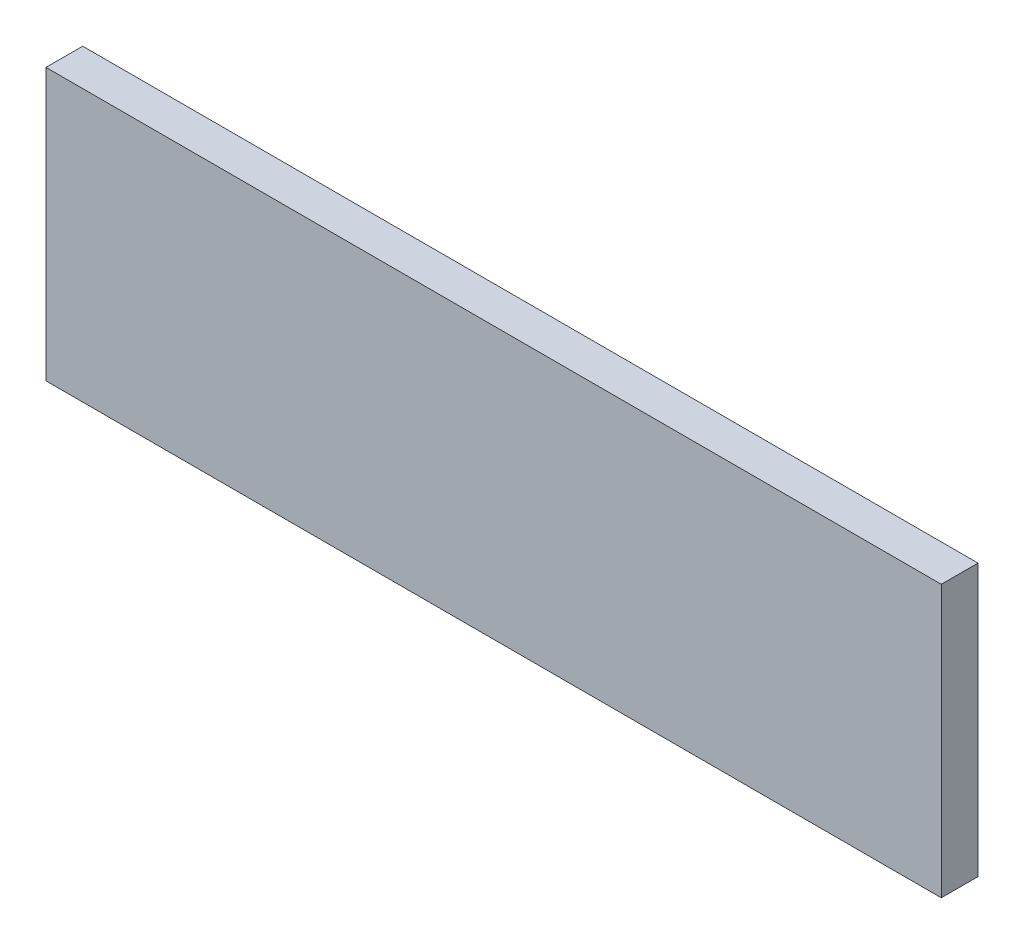
ISO-10303-21;
HEADER;
FILE_DESCRIPTION(('STEP AP214'),'2;1');
FILE_NAME('part.step','',(''),(''),'','','');
FILE_SCHEMA(('AUTOMOTIVE_DESIGN { 1 0 10303 214 1 1 1 1 }'));
ENDSEC;
DATA;
#1=APPLICATION_CONTEXT('core data for automotive mechanical design processes');
#2=APPLICATION_PROTOCOL_DEFINITION('international standard','automotive_design',2000,#1);
#3=PRODUCT_CONTEXT('',#1,'mechanical');
#4=PRODUCT('Part','Part','',(#3));
#5=PRODUCT_RELATED_PRODUCT_CATEGORY('part','',(#4));
#6=PRODUCT_DEFINITION_FORMATION('','',#4);
#7=PRODUCT_DEFINITION_CONTEXT('part definition',#1,'design');
#8=PRODUCT_DEFINITION('design','',#6,#7);
#9=PRODUCT_DEFINITION_SHAPE('','',#8);
#10=(LENGTH_UNIT() NAMED_UNIT(*) SI_UNIT(.MILLI.,.METRE.));
#11=(NAMED_UNIT(*) PLANE_ANGLE_UNIT() SI_UNIT($,.RADIAN.));
#12=(NAMED_UNIT(*) SI_UNIT($,.STERADIAN.) SOLID_ANGLE_UNIT());
#13=UNCERTAINTY_MEASURE_WITH_UNIT(LENGTH_MEASURE(1.E-05),#10,'distance_accuracy_value','');
#14=(GEOMETRIC_REPRESENTATION_CONTEXT(3) GLOBAL_UNCERTAINTY_ASSIGNED_CONTEXT((#13)) GLOBAL_UNIT_ASSIGNED_CONTEXT((#10,
#11,#12)) REPRESENTATION_CONTEXT('',''));
#15=CARTESIAN_POINT('',(0.,0.,0.));
#16=DIRECTION('',(0.,0.,1.));
#17=DIRECTION('',(1.,0.,0.));
#18=AXIS2_PLACEMENT_3D('',#15,#16,#17);
#19=CARTESIAN_POINT('',(-67.,67.,10.));
#20=DIRECTION('',(1.,0.,0.));
#21=DIRECTION('',(0.,1.,0.));
#22=AXIS2_PLACEMENT_3D('',#19,#20,#21);
#23=PLANE('',#22);
#24=DIRECTION('',(0.,-1.,0.));
#25=VECTOR('',#24,1.);
#26=CARTESIAN_POINT('',(-67.,67.,0.));
#27=LINE('',#26,#25);
#28=CARTESIAN_POINT('',(-67.,67.,0.));
#29=VERTEX_POINT('',#28);
#30=CARTESIAN_POINT('',(-67.,-7.00000000000001,0.));
#31=VERTEX_POINT('',#30);
#32=EDGE_CURVE('E96',#29,#31,#27,.T.);
#33=ORIENTED_EDGE('',*,*,#32,.T.);
#34=DIRECTION('',(0.,0.,-1.));
#35=VECTOR('',#34,1.);
#36=CARTESIAN_POINT('',(-67.,-7.00000000000001,10.));
#37=LINE('',#36,#35);
#38=CARTESIAN_POINT('',(-67.,-7.00000000000001,10.));
#39=VERTEX_POINT('',#38);
#40=EDGE_CURVE('E11',#39,#31,#37,.T.);
#41=ORIENTED_EDGE('',*,*,#40,.F.);
#42=DIRECTION('',(0.,-1.,0.));
#43=VECTOR('',#42,1.);
#44=CARTESIAN_POINT('',(-67.,67.,10.));
#45=LINE('',#44,#43);
#46=CARTESIAN_POINT('',(-67.,67.,10.));
#47=VERTEX_POINT('',#46);
#48=EDGE_CURVE('E84',#47,#39,#45,.T.);
#49=ORIENTED_EDGE('',*,*,#48,.F.);
#50=DIRECTION('',(0.,0.,-1.));
#51=VECTOR('',#50,1.);
#52=CARTESIAN_POINT('',(-67.,67.,10.));
#53=LINE('',#52,#51);
#54=EDGE_CURVE('E92',#47,#29,#53,.T.);
#55=ORIENTED_EDGE('',*,*,#54,.T.);
#56=EDGE_LOOP('',(#33,#41,#49,#55));
#57=FACE_BOUND('',#56,.T.);
#58=ADVANCED_FACE('F33',(#57),#23,.F.);
#59=CARTESIAN_POINT('',(-67.,-7.00000000000001,10.));
#60=DIRECTION('',(0.,1.,0.));
#61=DIRECTION('',(0.,0.,1.));
#62=AXIS2_PLACEMENT_3D('',#59,#60,#61);
#63=PLANE('',#62);
#64=DIRECTION('',(1.,0.,0.));
#65=VECTOR('',#64,1.);
#66=CARTESIAN_POINT('',(-67.,-7.00000000000001,0.));
#67=LINE('',#66,#65);
#68=CARTESIAN_POINT('',(177.,-7.00000000000001,0.));
#69=VERTEX_POINT('',#68);
#70=EDGE_CURVE('E88',#31,#69,#67,.T.);
#71=ORIENTED_EDGE('',*,*,#70,.T.);
#72=DIRECTION('',(0.,0.,-1.));
#73=VECTOR('',#72,1.);
#74=CARTESIAN_POINT('',(177.,-7.00000000000001,10.));
#75=LINE('',#74,#73);
#76=CARTESIAN_POINT('',(177.,-7.00000000000001,10.));
#77=VERTEX_POINT('',#76);
#78=EDGE_CURVE('E41',#77,#69,#75,.T.);
#79=ORIENTED_EDGE('',*,*,#78,.F.);
#80=DIRECTION('',(1.,0.,0.));
#81=VECTOR('',#80,1.);
#82=CARTESIAN_POINT('',(-67.,-7.00000000000001,10.));
#83=LINE('',#82,#81);
#84=EDGE_CURVE('E79',#39,#77,#83,.T.);
#85=ORIENTED_EDGE('',*,*,#84,.F.);
#86=ORIENTED_EDGE('',*,*,#40,.T.);
#87=EDGE_LOOP('',(#71,#79,#85,#86));
#88=FACE_BOUND('',#87,.T.);
#89=ADVANCED_FACE('F87',(#88),#63,.F.);
#90=CARTESIAN_POINT('',(177.,67.,10.));
#91=DIRECTION('',(-1.,0.,0.));
#92=DIRECTION('',(0.,0.,1.));
#93=AXIS2_PLACEMENT_3D('',#90,#91,#92);
#94=PLANE('',#93);
#95=DIRECTION('',(0.,1.,0.));
#96=VECTOR('',#95,1.);
#97=CARTESIAN_POINT('',(177.,67.,0.));
#98=LINE('',#97,#96);
#99=CARTESIAN_POINT('',(177.,67.,0.));
#100=VERTEX_POINT('',#99);
#101=EDGE_CURVE('E66',#69,#100,#98,.T.);
#102=ORIENTED_EDGE('',*,*,#101,.T.);
#103=DIRECTION('',(0.,0.,-1.));
#104=VECTOR('',#103,1.);
#105=CARTESIAN_POINT('',(177.,67.,10.));
#106=LINE('',#105,#104);
#107=CARTESIAN_POINT('',(177.,67.,10.));
#108=VERTEX_POINT('',#107);
#109=EDGE_CURVE('E89',#108,#100,#106,.T.);
#110=ORIENTED_EDGE('',*,*,#109,.F.);
#111=DIRECTION('',(0.,1.,0.));
#112=VECTOR('',#111,1.);
#113=CARTESIAN_POINT('',(177.,67.,10.));
#114=LINE('',#113,#112);
#115=EDGE_CURVE('E82',#77,#108,#114,.T.);
#116=ORIENTED_EDGE('',*,*,#115,.F.);
#117=ORIENTED_EDGE('',*,*,#78,.T.);
#118=EDGE_LOOP('',(#102,#110,#116,#117));
#119=FACE_BOUND('',#118,.T.);
#120=ADVANCED_FACE('F90',(#119),#94,.F.);
#121=CARTESIAN_POINT('',(-67.,67.,10.));
#122=DIRECTION('',(0.,-1.,0.));
#123=DIRECTION('',(0.,0.,-1.));
#124=AXIS2_PLACEMENT_3D('',#121,#122,#123);
#125=PLANE('',#124);
#126=DIRECTION('',(-1.,0.,0.));
#127=VECTOR('',#126,1.);
#128=CARTESIAN_POINT('',(-67.,67.,0.));
#129=LINE('',#128,#127);
#130=EDGE_CURVE('E72',#100,#29,#129,.T.);
#131=ORIENTED_EDGE('',*,*,#130,.T.);
#132=ORIENTED_EDGE('',*,*,#54,.F.);
#133=DIRECTION('',(-1.,0.,0.));
#134=VECTOR('',#133,1.);
#135=CARTESIAN_POINT('',(-67.,67.,10.));
#136=LINE('',#135,#134);
#137=EDGE_CURVE('E49',#108,#47,#136,.T.);
#138=ORIENTED_EDGE('',*,*,#137,.F.);
#139=ORIENTED_EDGE('',*,*,#109,.T.);
#140=EDGE_LOOP('',(#131,#132,#138,#139));
#141=FACE_BOUND('',#140,.T.);
#142=ADVANCED_FACE('F103',(#141),#125,.F.);
#143=CARTESIAN_POINT('',(0.,0.,10.));
#144=DIRECTION('',(0.,0.,1.));
#145=DIRECTION('',(1.,0.,0.));
#146=AXIS2_PLACEMENT_3D('',#143,#144,#145);
#147=PLANE('',#146);
#148=ORIENTED_EDGE('',*,*,#48,.T.);
#149=ORIENTED_EDGE('',*,*,#84,.T.);
#150=ORIENTED_EDGE('',*,*,#115,.T.);
#151=ORIENTED_EDGE('',*,*,#137,.T.);
#152=EDGE_LOOP('',(#148,#149,#150,#151));
#153=FACE_BOUND('',#152,.T.);
#154=ADVANCED_FACE('F80',(#153),#147,.T.);
#155=CARTESIAN_POINT('',(0.,0.,0.));
#156=DIRECTION('',(0.,0.,1.));
#157=DIRECTION('',(1.,0.,0.));
#158=AXIS2_PLACEMENT_3D('',#155,#156,#157);
#159=PLANE('',#158);
#160=ORIENTED_EDGE('',*,*,#32,.F.);
#161=ORIENTED_EDGE('',*,*,#130,.F.);
#162=ORIENTED_EDGE('',*,*,#101,.F.);
#163=ORIENTED_EDGE('',*,*,#70,.F.);
#164=EDGE_LOOP('',(#160,#161,#162,#163));
#165=FACE_BOUND('',#164,.T.);
#166=ADVANCED_FACE('F106',(#165),#159,.F.);
#167=CLOSED_SHELL('',(#58,#89,#120,#142,#154,#166));
#168=MANIFOLD_SOLID_BREP('B2',#167);
#169=ADVANCED_BREP_SHAPE_REPRESENTATION('',(#18,#168),#14);
#170=SHAPE_DEFINITION_REPRESENTATION(#9,#169);
ENDSEC;
END-ISO-10303-21;
